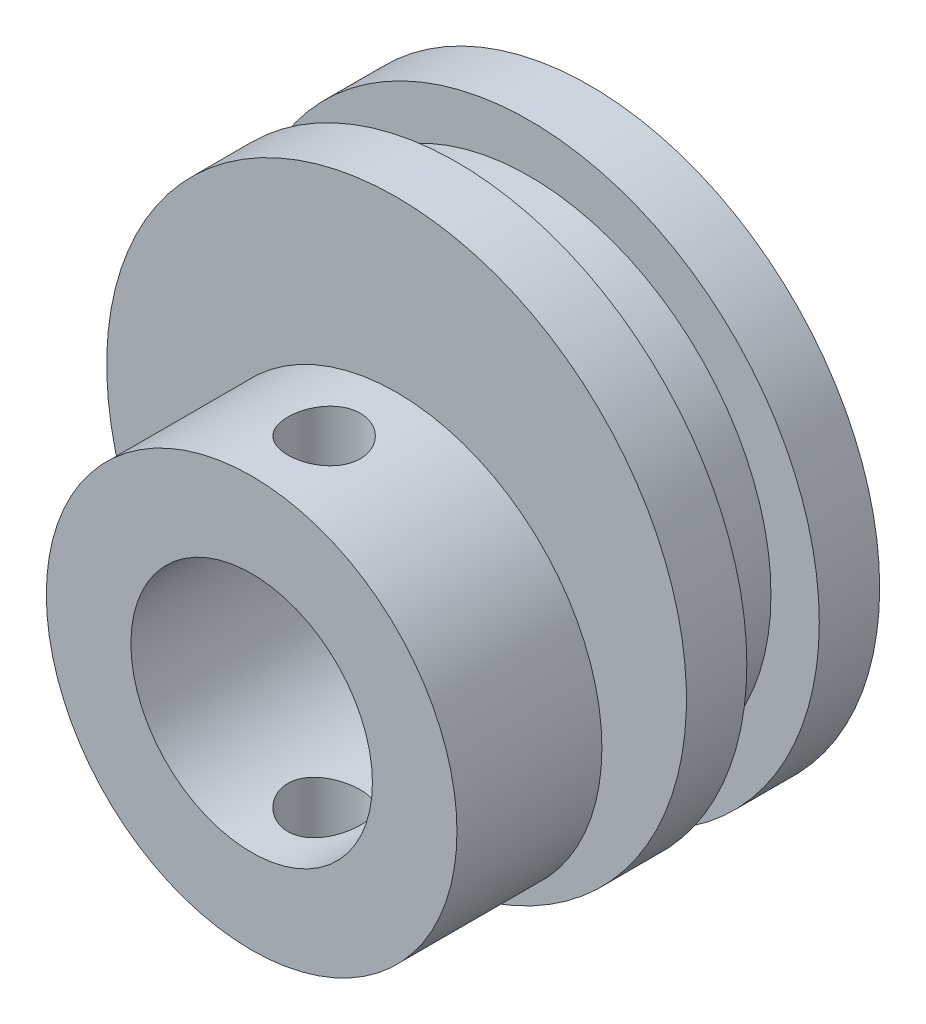
ISO-10303-21;
HEADER;
FILE_DESCRIPTION(('STEP AP214'),'2;1');
FILE_NAME('part.step','',(''),(''),'','','');
FILE_SCHEMA(('AUTOMOTIVE_DESIGN { 1 0 10303 214 1 1 1 1 }'));
ENDSEC;
DATA;
#1=APPLICATION_CONTEXT('core data for automotive mechanical design processes');
#2=APPLICATION_PROTOCOL_DEFINITION('international standard','automotive_design',2000,#1);
#3=PRODUCT_CONTEXT('',#1,'mechanical');
#4=PRODUCT('Part','Part','',(#3));
#5=PRODUCT_RELATED_PRODUCT_CATEGORY('part','',(#4));
#6=PRODUCT_DEFINITION_FORMATION('','',#4);
#7=PRODUCT_DEFINITION_CONTEXT('part definition',#1,'design');
#8=PRODUCT_DEFINITION('design','',#6,#7);
#9=PRODUCT_DEFINITION_SHAPE('','',#8);
#10=(LENGTH_UNIT() NAMED_UNIT(*) SI_UNIT(.MILLI.,.METRE.));
#11=(NAMED_UNIT(*) PLANE_ANGLE_UNIT() SI_UNIT($,.RADIAN.));
#12=(NAMED_UNIT(*) SI_UNIT($,.STERADIAN.) SOLID_ANGLE_UNIT());
#13=UNCERTAINTY_MEASURE_WITH_UNIT(LENGTH_MEASURE(1.E-05),#10,'distance_accuracy_value','');
#14=(GEOMETRIC_REPRESENTATION_CONTEXT(3) GLOBAL_UNCERTAINTY_ASSIGNED_CONTEXT((#13)) GLOBAL_UNIT_ASSIGNED_CONTEXT((#10,
#11,#12)) REPRESENTATION_CONTEXT('',''));
#15=CARTESIAN_POINT('',(0.,0.,0.));
#16=DIRECTION('',(0.,0.,1.));
#17=DIRECTION('',(1.,0.,0.));
#18=AXIS2_PLACEMENT_3D('',#15,#16,#17);
#19=CARTESIAN_POINT('',(0.,0.,4.));
#20=DIRECTION('',(0.,0.,-1.));
#21=DIRECTION('',(-1.,0.,0.));
#22=AXIS2_PLACEMENT_3D('',#19,#20,#21);
#23=CYLINDRICAL_SURFACE('',#22,12.);
#24=CARTESIAN_POINT('',(0.,0.,1.5));
#25=DIRECTION('',(0.,0.,1.));
#26=DIRECTION('',(1.,0.,0.));
#27=AXIS2_PLACEMENT_3D('',#24,#25,#26);
#28=CIRCLE('',#27,12.);
#29=CARTESIAN_POINT('',(12.,0.,1.5));
#30=VERTEX_POINT('',#29);
#31=EDGE_CURVE('E83',#30,#30,#28,.T.);
#32=ORIENTED_EDGE('',*,*,#31,.T.);
#33=EDGE_LOOP('',(#32));
#34=FACE_BOUND('',#33,.T.);
#35=CARTESIAN_POINT('',(0.,0.,4.));
#36=DIRECTION('',(0.,0.,1.));
#37=DIRECTION('',(1.,0.,0.));
#38=AXIS2_PLACEMENT_3D('',#35,#36,#37);
#39=CIRCLE('',#38,12.);
#40=CARTESIAN_POINT('',(0.,-12.,4.));
#41=VERTEX_POINT('',#40);
#42=EDGE_CURVE('E11',#41,#41,#39,.T.);
#43=ORIENTED_EDGE('',*,*,#42,.F.);
#44=EDGE_LOOP('',(#43));
#45=FACE_BOUND('',#44,.T.);
#46=ADVANCED_FACE('F39',(#34,#45),#23,.T.);
#47=CARTESIAN_POINT('',(0.,0.,4.));
#48=DIRECTION('',(0.,0.,1.));
#49=DIRECTION('',(1.,0.,0.));
#50=AXIS2_PLACEMENT_3D('',#47,#48,#49);
#51=PLANE('',#50);
#52=ORIENTED_EDGE('',*,*,#42,.T.);
#53=CARTESIAN_POINT('',(0.,-3.5,4.));
#54=DIRECTION('',(0.,0.,1.));
#55=DIRECTION('',(1.,0.,0.));
#56=AXIS2_PLACEMENT_3D('',#53,#54,#55);
#57=CIRCLE('',#56,8.5);
#58=EDGE_CURVE('E58',#41,#41,#57,.T.);
#59=ORIENTED_EDGE('',*,*,#58,.F.);
#60=EDGE_LOOP('',(#52,#59));
#61=FACE_BOUND('',#60,.T.);
#62=ADVANCED_FACE('F59',(#61),#51,.T.);
#63=CARTESIAN_POINT('',(0.,10.,1.5));
#64=DIRECTION('',(0.,0.,1.));
#65=DIRECTION('',(1.,0.,0.));
#66=AXIS2_PLACEMENT_3D('',#63,#64,#65);
#67=PLANE('',#66);
#68=CARTESIAN_POINT('',(0.,0.,1.5));
#69=DIRECTION('',(0.,0.,-1.));
#70=DIRECTION('',(-1.,0.,0.));
#71=AXIS2_PLACEMENT_3D('',#68,#69,#70);
#72=CIRCLE('',#71,10.);
#73=CARTESIAN_POINT('',(-10.,0.,1.5));
#74=VERTEX_POINT('',#73);
#75=EDGE_CURVE('E68',#74,#74,#72,.T.);
#76=ORIENTED_EDGE('',*,*,#75,.F.);
#77=EDGE_LOOP('',(#76));
#78=FACE_BOUND('',#77,.T.);
#79=ORIENTED_EDGE('',*,*,#31,.F.);
#80=EDGE_LOOP('',(#79));
#81=FACE_BOUND('',#80,.T.);
#82=ADVANCED_FACE('F146',(#78,#81),#67,.F.);
#83=CARTESIAN_POINT('',(0.,10.,-1.5));
#84=DIRECTION('',(0.,0.,-1.));
#85=DIRECTION('',(-1.,0.,0.));
#86=AXIS2_PLACEMENT_3D('',#83,#84,#85);
#87=PLANE('',#86);
#88=CARTESIAN_POINT('',(0.,0.,-1.5));
#89=DIRECTION('',(0.,0.,-1.));
#90=DIRECTION('',(-1.,0.,0.));
#91=AXIS2_PLACEMENT_3D('',#88,#89,#90);
#92=CIRCLE('',#91,10.);
#93=CARTESIAN_POINT('',(-10.,0.,-1.5));
#94=VERTEX_POINT('',#93);
#95=EDGE_CURVE('E73',#94,#94,#92,.T.);
#96=ORIENTED_EDGE('',*,*,#95,.T.);
#97=EDGE_LOOP('',(#96));
#98=FACE_BOUND('',#97,.T.);
#99=CARTESIAN_POINT('',(0.,0.,-1.5));
#100=DIRECTION('',(0.,0.,-1.));
#101=DIRECTION('',(-1.,0.,0.));
#102=AXIS2_PLACEMENT_3D('',#99,#100,#101);
#103=CIRCLE('',#102,12.);
#104=CARTESIAN_POINT('',(-12.,0.,-1.5));
#105=VERTEX_POINT('',#104);
#106=EDGE_CURVE('E80',#105,#105,#103,.T.);
#107=ORIENTED_EDGE('',*,*,#106,.F.);
#108=EDGE_LOOP('',(#107));
#109=FACE_BOUND('',#108,.T.);
#110=ADVANCED_FACE('F165',(#98,#109),#87,.F.);
#111=CARTESIAN_POINT('',(0.,0.,0.));
#112=DIRECTION('',(0.,0.,-1.));
#113=DIRECTION('',(-1.,0.,0.));
#114=AXIS2_PLACEMENT_3D('',#111,#112,#113);
#115=CYLINDRICAL_SURFACE('',#114,10.);
#116=ORIENTED_EDGE('',*,*,#95,.F.);
#117=EDGE_LOOP('',(#116));
#118=FACE_BOUND('',#117,.T.);
#119=ORIENTED_EDGE('',*,*,#75,.T.);
#120=EDGE_LOOP('',(#119));
#121=FACE_BOUND('',#120,.T.);
#122=ADVANCED_FACE('F114',(#118,#121),#115,.T.);
#123=CARTESIAN_POINT('',(0.,0.,-4.));
#124=DIRECTION('',(0.,0.,1.));
#125=DIRECTION('',(1.,0.,0.));
#126=AXIS2_PLACEMENT_3D('',#123,#124,#125);
#127=PLANE('',#126);
#128=CARTESIAN_POINT('',(0.,-3.5,-4.));
#129=DIRECTION('',(0.,0.,1.));
#130=DIRECTION('',(1.,0.,0.));
#131=AXIS2_PLACEMENT_3D('',#128,#129,#130);
#132=CIRCLE('',#131,5.);
#133=CARTESIAN_POINT('',(5.,-3.5,-4.));
#134=VERTEX_POINT('',#133);
#135=EDGE_CURVE('E62',#134,#134,#132,.T.);
#136=ORIENTED_EDGE('',*,*,#135,.T.);
#137=EDGE_LOOP('',(#136));
#138=FACE_BOUND('',#137,.T.);
#139=CARTESIAN_POINT('',(0.,0.,-4.));
#140=DIRECTION('',(0.,0.,1.));
#141=DIRECTION('',(1.,0.,0.));
#142=AXIS2_PLACEMENT_3D('',#139,#140,#141);
#143=CIRCLE('',#142,12.);
#144=CARTESIAN_POINT('',(12.,0.,-4.));
#145=VERTEX_POINT('',#144);
#146=EDGE_CURVE('E55',#145,#145,#143,.T.);
#147=ORIENTED_EDGE('',*,*,#146,.F.);
#148=EDGE_LOOP('',(#147));
#149=FACE_BOUND('',#148,.T.);
#150=ADVANCED_FACE('F147',(#138,#149),#127,.F.);
#151=ORIENTED_EDGE('',*,*,#106,.T.);
#152=EDGE_LOOP('',(#151));
#153=FACE_BOUND('',#152,.T.);
#154=ORIENTED_EDGE('',*,*,#146,.T.);
#155=EDGE_LOOP('',(#154));
#156=FACE_BOUND('',#155,.T.);
#157=ADVANCED_FACE('F41',(#153,#156),#23,.T.);
#158=CARTESIAN_POINT('',(0.,-3.5,10.));
#159=DIRECTION('',(0.,0.,-1.));
#160=DIRECTION('',(-1.,0.,0.));
#161=AXIS2_PLACEMENT_3D('',#158,#159,#160);
#162=CYLINDRICAL_SURFACE('',#161,8.5);
#163=CARTESIAN_POINT('',(0.,5.,8.5));
#164=CARTESIAN_POINT('',(-0.0835602073116835,4.99999852465812,8.4999967178691));
#165=CARTESIAN_POINT('',(-0.167164170899166,4.99875504437695,8.49299410009958));
#166=CARTESIAN_POINT('',(-0.332022204672921,4.99391434547826,8.46518320685825));
#167=CARTESIAN_POINT('',(-0.413274128543539,4.99031504366607,8.44436271235211));
#168=CARTESIAN_POINT('',(-0.571019510053261,4.9811659180518,8.38956848670668));
#169=CARTESIAN_POINT('',(-0.647516980962109,4.97561776634703,8.35560602873436));
#170=CARTESIAN_POINT('',(-0.793719300559721,4.9631790616307,8.27552262272467));
#171=CARTESIAN_POINT('',(-0.863424820850617,4.95628864154791,8.22940287849939));
#172=CARTESIAN_POINT('',(-0.99481651654955,4.94184556474541,8.12579132915274));
#173=CARTESIAN_POINT('',(-1.05641975336287,4.93428721228608,8.06819513097525));
#174=CARTESIAN_POINT('',(-1.1691412650637,4.91940313016037,7.94349027020933));
#175=CARTESIAN_POINT('',(-1.22025883768728,4.9120774161024,7.87638097100183));
#176=CARTESIAN_POINT('',(-1.31089615224234,4.89843282674879,7.73397760532877));
#177=CARTESIAN_POINT('',(-1.35033279728854,4.89212130489153,7.65862988281188));
#178=CARTESIAN_POINT('',(-1.41595715270317,4.88129933378097,7.5022490569533));
#179=CARTESIAN_POINT('',(-1.44214587005801,4.87678874764249,7.42121638626272));
#180=CARTESIAN_POINT('',(-1.48026740658905,4.87013636121934,7.25664894310292));
#181=CARTESIAN_POINT('',(-1.49234409471487,4.86797067223513,7.17314848174711));
#182=CARTESIAN_POINT('',(-1.50234505486158,4.86618114129228,7.00528048894824));
#183=CARTESIAN_POINT('',(-1.50027044993802,4.86655709762705,6.92091302684148));
#184=CARTESIAN_POINT('',(-1.48214465879202,4.86978659532625,6.75473986745596));
#185=CARTESIAN_POINT('',(-1.46625598617925,4.87261132730481,6.67291580162267));
#186=CARTESIAN_POINT('',(-1.42120852873224,4.88037493445764,6.51311326819002));
#187=CARTESIAN_POINT('',(-1.39204923880641,4.88531389010072,6.43513494708836));
#188=CARTESIAN_POINT('',(-1.32112618145376,4.89678011228507,6.28475593979735));
#189=CARTESIAN_POINT('',(-1.27929578300233,4.90331573888177,6.21238734241572));
#190=CARTESIAN_POINT('',(-1.18426514162452,4.91723322878402,6.075634979316));
#191=CARTESIAN_POINT('',(-1.13106387280683,4.92461516841691,6.0112519348913));
#192=CARTESIAN_POINT('',(-1.01392044402847,4.93951963661095,5.89135835341984));
#193=CARTESIAN_POINT('',(-0.949839043227183,4.94704269154381,5.83598383870425));
#194=CARTESIAN_POINT('',(-0.813223017047742,4.96128697681384,5.73675182224637));
#195=CARTESIAN_POINT('',(-0.74068832425797,4.96800820075587,5.69289441235745));
#196=CARTESIAN_POINT('',(-0.58909043349764,4.97990283414647,5.61792570133133));
#197=CARTESIAN_POINT('',(-0.510020681297826,4.98507466502145,5.58682738775337));
#198=CARTESIAN_POINT('',(-0.347668482380529,4.99327535201155,5.53839100335812));
#199=CARTESIAN_POINT('',(-0.264386432134316,4.99630440940878,5.52105164007075));
#200=CARTESIAN_POINT('',(-0.0971451116191692,4.99985092576813,5.50081200141636));
#201=CARTESIAN_POINT('',(-0.0132090843615073,5.00040083433622,5.49772516159403));
#202=CARTESIAN_POINT('',(0.153980271251543,4.99901631664242,5.50557941294352));
#203=CARTESIAN_POINT('',(0.237233629020516,4.99708199798832,5.51651989650209));
#204=CARTESIAN_POINT('',(0.400111048540306,4.99096650695861,5.55196307734012));
#205=CARTESIAN_POINT('',(0.479756042957809,4.98680079660993,5.57637247882884));
#206=CARTESIAN_POINT('',(0.633823333081783,4.97668767054273,5.63796046041181));
#207=CARTESIAN_POINT('',(0.708245306379776,4.97074014495488,5.67513982794151));
#208=CARTESIAN_POINT('',(0.850557919353285,4.95764232694309,5.7616330721365));
#209=CARTESIAN_POINT('',(0.918377380876573,4.95048081539685,5.81106232996766));
#210=CARTESIAN_POINT('',(1.04482575376698,4.93578086254215,5.92049471234006));
#211=CARTESIAN_POINT('',(1.10345391044434,4.92824239034875,5.98049870430486));
#212=CARTESIAN_POINT('',(1.21055495751759,4.91353196779635,6.11021768885172));
#213=CARTESIAN_POINT('',(1.25890120329949,4.90636532837837,6.18003794375939));
#214=CARTESIAN_POINT('',(1.34317887649159,4.89331262284435,6.32691843383291));
#215=CARTESIAN_POINT('',(1.37911073038509,4.88742651273966,6.40397842016974));
#216=CARTESIAN_POINT('',(1.43735470236499,4.87764200573802,6.56281171816086));
#217=CARTESIAN_POINT('',(1.45972757437841,4.8737347552807,6.64456218099255));
#218=CARTESIAN_POINT('',(1.49040804698522,4.86832903130758,6.81073623477485));
#219=CARTESIAN_POINT('',(1.4987170345307,4.86683032026719,6.89515956129641));
#220=CARTESIAN_POINT('',(1.50099164151106,4.86642243845549,7.0630165247977));
#221=CARTESIAN_POINT('',(1.49515678461176,4.86747724556748,7.14644743680322));
#222=CARTESIAN_POINT('',(1.46974322873663,4.87197817944576,7.31111994714207));
#223=CARTESIAN_POINT('',(1.45016459057914,4.87542429563016,7.39236155516174));
#224=CARTESIAN_POINT('',(1.39789926667029,4.88430518558531,7.55025834545232));
#225=CARTESIAN_POINT('',(1.36523178909751,4.88973704421377,7.62692006020943));
#226=CARTESIAN_POINT('',(1.2877371522897,4.90197983656061,7.77370686948198));
#227=CARTESIAN_POINT('',(1.24290927156669,4.90879085209956,7.84383157581883));
#228=CARTESIAN_POINT('',(1.1416626166475,4.92313765215559,7.97655797659853));
#229=CARTESIAN_POINT('',(1.0850977566265,4.93068186379938,8.0390473401217));
#230=CARTESIAN_POINT('',(0.962289483399127,4.94557973306428,8.15371472848376));
#231=CARTESIAN_POINT('',(0.896043845959504,4.95293334643561,8.20589037716824));
#232=CARTESIAN_POINT('',(0.755134398648692,4.96668871310451,8.29882734392791));
#233=CARTESIAN_POINT('',(0.680408643630285,4.97308254914894,8.33949593597092));
#234=CARTESIAN_POINT('',(0.525100290133701,4.9841208835999,8.40763861326231));
#235=CARTESIAN_POINT('',(0.444523462097549,4.98876707834471,8.43512550042316));
#236=CARTESIAN_POINT('',(0.303055940544959,4.99480295232011,8.47033309128865));
#237=CARTESIAN_POINT('',(0.243008531002894,4.99674116179219,8.48143982639593));
#238=CARTESIAN_POINT('',(0.121981841577228,4.9993402109253,8.49627440232578));
#239=CARTESIAN_POINT('',(0.0610025810358461,5.00000107706366,8.50000239609813));
#240=CARTESIAN_POINT('',(0.,5.,8.5));
#241=B_SPLINE_CURVE_WITH_KNOTS('',3,(#163,#164,#165,#166,#167,#168,#169,#170,#171,#172,#173,
#174,#175,#176,#177,#178,#179,#180,#181,#182,#183,#184,#185,#186,#187,#188,#189,#190,#191,#192,
#193,#194,#195,#196,#197,#198,#199,#200,#201,#202,#203,#204,#205,#206,#207,#208,#209,#210,#211,
#212,#213,#214,#215,#216,#217,#218,#219,#220,#221,#222,#223,#224,#225,#226,#227,#228,#229,#230,
#231,#232,#233,#234,#235,#236,#237,#238,#239,#240),.UNSPECIFIED.,.T.,.F.,(4,2,2,2,2,2,2,2,2,2,2,
2,2,2,2,2,2,2,2,2,2,2,2,2,2,2,2,2,2,2,2,2,2,2,2,2,2,2,4),(0.,0.250457591265239,
0.501136955741326,0.751601762620913,1.0020417778349,1.25487340234721,1.50772195440904,
1.76232827341925,2.01691523667498,2.26888345171767,2.52083167063641,2.76985538403527,
3.01888857629236,3.26925473797252,3.51964349748054,3.7735186488756,4.02739582496181,
4.28153078678122,4.53564187317985,4.78641705372855,5.03718137196445,5.2862301259127,
5.53529423973253,5.78679991739404,6.0383262351567,6.29279109855223,6.54724721920708,
6.80055459873066,7.05383699613264,7.30356724592812,7.55329639063616,7.80266038647827,
8.05203918055447,8.30473127243322,8.55748151381616,8.81221395085161,9.06669849128298,
9.24954720252122,9.43239212355177),.UNSPECIFIED.);
#242=CARTESIAN_POINT('',(0.,5.,8.5));
#243=VERTEX_POINT('',#242);
#244=EDGE_CURVE('E120',#243,#243,#241,.T.);
#245=ORIENTED_EDGE('',*,*,#244,.T.);
#246=EDGE_LOOP('',(#245));
#247=FACE_BOUND('',#246,.T.);
#248=CARTESIAN_POINT('',(0.,-12.,8.5));
#249=CARTESIAN_POINT('',(0.0835602073116835,-11.9999985246581,8.4999967178691));
#250=CARTESIAN_POINT('',(0.167164170899166,-11.998755044377,8.49299410009958));
#251=CARTESIAN_POINT('',(0.33202220467292,-11.9939143454783,8.46518320685825));
#252=CARTESIAN_POINT('',(0.413274128543538,-11.9903150436661,8.44436271235211));
#253=CARTESIAN_POINT('',(0.571019510053261,-11.9811659180518,8.38956848670668));
#254=CARTESIAN_POINT('',(0.647516980962108,-11.975617766347,8.35560602873436));
#255=CARTESIAN_POINT('',(0.79371930055972,-11.9631790616307,8.27552262272467));
#256=CARTESIAN_POINT('',(0.863424820850616,-11.9562886415479,8.22940287849939));
#257=CARTESIAN_POINT('',(0.994816516549548,-11.9418455647454,8.12579132915275));
#258=CARTESIAN_POINT('',(1.05641975336287,-11.9342872122861,8.06819513097525));
#259=CARTESIAN_POINT('',(1.1691412650637,-11.9194031301604,7.94349027020934));
#260=CARTESIAN_POINT('',(1.22025883768728,-11.9120774161024,7.87638097100183));
#261=CARTESIAN_POINT('',(1.31089615224234,-11.8984328267488,7.73397760532877));
#262=CARTESIAN_POINT('',(1.35033279728854,-11.8921213048915,7.65862988281188));
#263=CARTESIAN_POINT('',(1.41595715270317,-11.881299333781,7.5022490569533));
#264=CARTESIAN_POINT('',(1.44214587005801,-11.8767887476425,7.42121638626272));
#265=CARTESIAN_POINT('',(1.48026740658905,-11.8701363612193,7.25664894310292));
#266=CARTESIAN_POINT('',(1.49234409471487,-11.8679706722351,7.17314848174711));
#267=CARTESIAN_POINT('',(1.50234505486158,-11.8661811412923,7.00528048894824));
#268=CARTESIAN_POINT('',(1.50027044993802,-11.8665570976271,6.92091302684149));
#269=CARTESIAN_POINT('',(1.48214465879202,-11.8697865953263,6.75473986745596));
#270=CARTESIAN_POINT('',(1.46625598617925,-11.8726113273048,6.67291580162267));
#271=CARTESIAN_POINT('',(1.42120852873224,-11.8803749344576,6.51311326819002));
#272=CARTESIAN_POINT('',(1.39204923880641,-11.8853138901007,6.43513494708836));
#273=CARTESIAN_POINT('',(1.32112618145376,-11.8967801122851,6.28475593979735));
#274=CARTESIAN_POINT('',(1.27929578300233,-11.9033157388818,6.21238734241572));
#275=CARTESIAN_POINT('',(1.18426514162452,-11.917233228784,6.075634979316));
#276=CARTESIAN_POINT('',(1.13106387280683,-11.9246151684169,6.0112519348913));
#277=CARTESIAN_POINT('',(1.01392044402847,-11.939519636611,5.89135835341984));
#278=CARTESIAN_POINT('',(0.949839043227182,-11.9470426915438,5.83598383870425));
#279=CARTESIAN_POINT('',(0.813223017047741,-11.9612869768138,5.73675182224637));
#280=CARTESIAN_POINT('',(0.74068832425797,-11.9680082007559,5.69289441235744));
#281=CARTESIAN_POINT('',(0.58909043349764,-11.9799028341465,5.61792570133133));
#282=CARTESIAN_POINT('',(0.510020681297825,-11.9850746650215,5.58682738775337));
#283=CARTESIAN_POINT('',(0.347668482380528,-11.9932753520116,5.53839100335812));
#284=CARTESIAN_POINT('',(0.264386432134316,-11.9963044094088,5.52105164007075));
#285=CARTESIAN_POINT('',(0.0971451116191684,-11.9998509257681,5.50081200141636));
#286=CARTESIAN_POINT('',(0.0132090843615066,-12.0004008343362,5.49772516159403));
#287=CARTESIAN_POINT('',(-0.153980271251543,-11.9990163166424,5.50557941294352));
#288=CARTESIAN_POINT('',(-0.237233629020516,-11.9970819979883,5.51651989650209));
#289=CARTESIAN_POINT('',(-0.400111048540306,-11.9909665069586,5.55196307734012));
#290=CARTESIAN_POINT('',(-0.479756042957809,-11.9868007966099,5.57637247882884));
#291=CARTESIAN_POINT('',(-0.633823333081783,-11.9766876705427,5.63796046041181));
#292=CARTESIAN_POINT('',(-0.708245306379776,-11.9707401449549,5.67513982794151));
#293=CARTESIAN_POINT('',(-0.850557919353285,-11.9576423269431,5.7616330721365));
#294=CARTESIAN_POINT('',(-0.918377380876573,-11.9504808153968,5.81106232996766));
#295=CARTESIAN_POINT('',(-1.04482575376698,-11.9357808625422,5.92049471234006));
#296=CARTESIAN_POINT('',(-1.10345391044434,-11.9282423903488,5.98049870430486));
#297=CARTESIAN_POINT('',(-1.21055495751759,-11.9135319677964,6.11021768885172));
#298=CARTESIAN_POINT('',(-1.25890120329949,-11.9063653283784,6.18003794375939));
#299=CARTESIAN_POINT('',(-1.34317887649159,-11.8933126228444,6.32691843383291));
#300=CARTESIAN_POINT('',(-1.37911073038509,-11.8874265127397,6.40397842016974));
#301=CARTESIAN_POINT('',(-1.43735470236499,-11.877642005738,6.56281171816086));
#302=CARTESIAN_POINT('',(-1.45972757437841,-11.8737347552807,6.64456218099255));
#303=CARTESIAN_POINT('',(-1.49040804698522,-11.8683290313076,6.81073623477485));
#304=CARTESIAN_POINT('',(-1.4987170345307,-11.8668303202672,6.89515956129642));
#305=CARTESIAN_POINT('',(-1.50099164151106,-11.8664224384555,7.0630165247977));
#306=CARTESIAN_POINT('',(-1.49515678461176,-11.8674772455675,7.14644743680323));
#307=CARTESIAN_POINT('',(-1.46974322873663,-11.8719781794458,7.31111994714207));
#308=CARTESIAN_POINT('',(-1.45016459057914,-11.8754242956302,7.39236155516174));
#309=CARTESIAN_POINT('',(-1.39789926667029,-11.8843051855853,7.55025834545232));
#310=CARTESIAN_POINT('',(-1.36523178909751,-11.8897370442138,7.62692006020943));
#311=CARTESIAN_POINT('',(-1.2877371522897,-11.9019798365606,7.77370686948198));
#312=CARTESIAN_POINT('',(-1.24290927156669,-11.9087908520996,7.84383157581884));
#313=CARTESIAN_POINT('',(-1.1416626166475,-11.9231376521556,7.97655797659853));
#314=CARTESIAN_POINT('',(-1.0850977566265,-11.9306818637994,8.0390473401217));
#315=CARTESIAN_POINT('',(-0.962289483399125,-11.9455797330643,8.15371472848376));
#316=CARTESIAN_POINT('',(-0.896043845959503,-11.9529333464356,8.20589037716825));
#317=CARTESIAN_POINT('',(-0.75513439864869,-11.9666887131045,8.29882734392791));
#318=CARTESIAN_POINT('',(-0.680408643630283,-11.9730825491489,8.33949593597092));
#319=CARTESIAN_POINT('',(-0.525100290133698,-11.9841208835999,8.40763861326231));
#320=CARTESIAN_POINT('',(-0.444523462097546,-11.9887670783447,8.43512550042317));
#321=CARTESIAN_POINT('',(-0.303055940544957,-11.9948029523201,8.47033309128865));
#322=CARTESIAN_POINT('',(-0.243008531002893,-11.9967411617922,8.48143982639593));
#323=CARTESIAN_POINT('',(-0.121981841577228,-11.9993402109253,8.49627440232578));
#324=CARTESIAN_POINT('',(-0.061002581035846,-12.0000010770637,8.50000239609813));
#325=CARTESIAN_POINT('',(0.,-12.,8.5));
#326=B_SPLINE_CURVE_WITH_KNOTS('',3,(#248,#249,#250,#251,#252,#253,#254,#255,#256,#257,#258,
#259,#260,#261,#262,#263,#264,#265,#266,#267,#268,#269,#270,#271,#272,#273,#274,#275,#276,#277,
#278,#279,#280,#281,#282,#283,#284,#285,#286,#287,#288,#289,#290,#291,#292,#293,#294,#295,#296,
#297,#298,#299,#300,#301,#302,#303,#304,#305,#306,#307,#308,#309,#310,#311,#312,#313,#314,#315,
#316,#317,#318,#319,#320,#321,#322,#323,#324,#325),.UNSPECIFIED.,.T.,.F.,(4,2,2,2,2,2,2,2,2,2,2,
2,2,2,2,2,2,2,2,2,2,2,2,2,2,2,2,2,2,2,2,2,2,2,2,2,2,2,4),(0.,0.250457591265239,
0.501136955741326,0.751601762620913,1.0020417778349,1.25487340234721,1.50772195440904,
1.76232827341925,2.01691523667498,2.26888345171766,2.52083167063641,2.76985538403527,
3.01888857629236,3.26925473797252,3.51964349748054,3.7735186488756,4.02739582496181,
4.28153078678122,4.53564187317985,4.78641705372855,5.03718137196445,5.2862301259127,
5.53529423973253,5.78679991739404,6.0383262351567,6.29279109855223,6.54724721920708,
6.80055459873066,7.05383699613265,7.30356724592812,7.55329639063616,7.80266038647828,
8.05203918055447,8.30473127243323,8.55748151381616,8.81221395085161,9.06669849128298,
9.24954720252122,9.43239212355177),.UNSPECIFIED.);
#327=CARTESIAN_POINT('',(0.,-12.,8.5));
#328=VERTEX_POINT('',#327);
#329=EDGE_CURVE('E124',#328,#328,#326,.T.);
#330=ORIENTED_EDGE('',*,*,#329,.T.);
#331=EDGE_LOOP('',(#330));
#332=FACE_BOUND('',#331,.T.);
#333=CARTESIAN_POINT('',(0.,-3.5,10.));
#334=DIRECTION('',(0.,0.,1.));
#335=DIRECTION('',(1.,0.,0.));
#336=AXIS2_PLACEMENT_3D('',#333,#334,#335);
#337=CIRCLE('',#336,8.5);
#338=CARTESIAN_POINT('',(8.5,-3.5,10.));
#339=VERTEX_POINT('',#338);
#340=EDGE_CURVE('E65',#339,#339,#337,.T.);
#341=ORIENTED_EDGE('',*,*,#340,.F.);
#342=EDGE_LOOP('',(#341));
#343=FACE_BOUND('',#342,.T.);
#344=ORIENTED_EDGE('',*,*,#58,.T.);
#345=EDGE_LOOP('',(#344));
#346=FACE_BOUND('',#345,.T.);
#347=ADVANCED_FACE('F110',(#247,#332,#343,#346),#162,.T.);
#348=CARTESIAN_POINT('',(0.,-3.5,10.));
#349=DIRECTION('',(0.,0.,1.));
#350=DIRECTION('',(1.,0.,0.));
#351=AXIS2_PLACEMENT_3D('',#348,#349,#350);
#352=PLANE('',#351);
#353=CARTESIAN_POINT('',(0.,-3.5,10.000012));
#354=DIRECTION('',(0.,0.,1.));
#355=DIRECTION('',(1.,0.,0.));
#356=AXIS2_PLACEMENT_3D('',#353,#354,#355);
#357=CIRCLE('',#356,5.);
#358=CARTESIAN_POINT('',(5.,-3.5,10.000012));
#359=VERTEX_POINT('',#358);
#360=EDGE_CURVE('E70',#359,#359,#357,.T.);
#361=ORIENTED_EDGE('',*,*,#360,.F.);
#362=EDGE_LOOP('',(#361));
#363=FACE_BOUND('',#362,.T.);
#364=ORIENTED_EDGE('',*,*,#340,.T.);
#365=EDGE_LOOP('',(#364));
#366=FACE_BOUND('',#365,.T.);
#367=ADVANCED_FACE('F100',(#363,#366),#352,.T.);
#368=CARTESIAN_POINT('',(0.,-3.5,-4.));
#369=DIRECTION('',(0.,0.,1.));
#370=DIRECTION('',(1.,0.,0.));
#371=AXIS2_PLACEMENT_3D('',#368,#369,#370);
#372=CYLINDRICAL_SURFACE('',#371,5.);
#373=CARTESIAN_POINT('',(0.,-8.5,8.5));
#374=CARTESIAN_POINT('',(-0.0822886127532998,-8.4999992925055,8.49999900251511));
#375=CARTESIAN_POINT('',(-0.164587318351529,-8.49794915693954,8.49320613637603));
#376=CARTESIAN_POINT('',(-0.32678812530488,-8.48997105593691,8.4662786457779));
#377=CARTESIAN_POINT('',(-0.406689504411419,-8.48404193389692,8.44614004197666));
#378=CARTESIAN_POINT('',(-0.561732707754526,-8.46895552501836,8.39325398308974));
#379=CARTESIAN_POINT('',(-0.636881364395373,-8.45980300250426,8.36052513038107));
#380=CARTESIAN_POINT('',(-0.780624181053131,-8.43922109237645,8.28346390694417));
#381=CARTESIAN_POINT('',(-0.849217467469669,-8.42779140192067,8.23912999260458));
#382=CARTESIAN_POINT('',(-0.979871797183745,-8.40350737192774,8.13877599252733));
#383=CARTESIAN_POINT('',(-1.04171807124434,-8.39062383657036,8.08248337411409));
#384=CARTESIAN_POINT('',(-1.15524920923324,-8.36505834210442,7.96039077008982));
#385=CARTESIAN_POINT('',(-1.20693236327441,-8.35237641724502,7.89458918787504));
#386=CARTESIAN_POINT('',(-1.29980037723708,-8.32834113993772,7.75352924696239));
#387=CARTESIAN_POINT('',(-1.34072309022213,-8.31702406663875,7.67809153900926));
#388=CARTESIAN_POINT('',(-1.4092139477476,-8.29743620394031,7.52101074576971));
#389=CARTESIAN_POINT('',(-1.43678529919973,-8.28916468313311,7.43936915607203));
#390=CARTESIAN_POINT('',(-1.47701633682652,-8.27690870838434,7.27460973386954));
#391=CARTESIAN_POINT('',(-1.49007196234677,-8.27281069324534,7.19159725613606));
#392=CARTESIAN_POINT('',(-1.50213730614672,-8.26902789749768,7.02446684378324));
#393=CARTESIAN_POINT('',(-1.50115042761078,-8.26934204760571,6.94034918194091));
#394=CARTESIAN_POINT('',(-1.48546977199812,-8.27424744067778,6.77661609139152));
#395=CARTESIAN_POINT('',(-1.47127205262685,-8.27868388599141,6.69694774963776));
#396=CARTESIAN_POINT('',(-1.43037420427056,-8.29108356228624,6.54118021372654));
#397=CARTESIAN_POINT('',(-1.40367284141641,-8.29904714132351,6.46508137262567));
#398=CARTESIAN_POINT('',(-1.33816026653682,-8.31772733074973,6.31739965033926));
#399=CARTESIAN_POINT('',(-1.29918816934642,-8.32848016115952,6.24589291604474));
#400=CARTESIAN_POINT('',(-1.21035222588683,-8.35150987000065,6.11026797798981));
#401=CARTESIAN_POINT('',(-1.16048574002588,-8.36378711746991,6.04615157058622));
#402=CARTESIAN_POINT('',(-1.04881290765546,-8.38911011297937,5.92431380923798));
#403=CARTESIAN_POINT('',(-0.986594907466972,-8.40216654310498,5.86697133597033));
#404=CARTESIAN_POINT('',(-0.853263259313968,-8.42712244063259,5.76344601593575));
#405=CARTESIAN_POINT('',(-0.782149051860889,-8.4390218351841,5.71726387158557));
#406=CARTESIAN_POINT('',(-0.632355038342804,-8.4604316006947,5.63714007753527));
#407=CARTESIAN_POINT('',(-0.553627749747951,-8.46992543668314,5.60328248375014));
#408=CARTESIAN_POINT('',(-0.39124541560352,-8.48533521832222,5.54940040990037));
#409=CARTESIAN_POINT('',(-0.307591751589582,-8.49125216187,5.52937207146751));
#410=CARTESIAN_POINT('',(-0.140952242668332,-8.49868364643539,5.50434782210061));
#411=CARTESIAN_POINT('',(-0.0580500976011877,-8.5003485041779,5.49883841419839));
#412=CARTESIAN_POINT('',(0.107499605823382,-8.4995292324176,5.50156915571208));
#413=CARTESIAN_POINT('',(0.19014719669078,-8.49704565677757,5.50980746965144));
#414=CARTESIAN_POINT('',(0.350903605309696,-8.48830696987163,5.53938461111149));
#415=CARTESIAN_POINT('',(0.429072772614168,-8.48213829799417,5.56042338758087));
#416=CARTESIAN_POINT('',(0.580754638954521,-8.46674347841533,5.6146432327782));
#417=CARTESIAN_POINT('',(0.654266777025583,-8.45751696321085,5.64782576103786));
#418=CARTESIAN_POINT('',(0.796437189461052,-8.43669654351325,5.72625316548113));
#419=CARTESIAN_POINT('',(0.864943826199669,-8.42505280829675,5.77175934094797));
#420=CARTESIAN_POINT('',(0.993523307980146,-8.40073468764318,5.87322475405281));
#421=CARTESIAN_POINT('',(1.05359403235593,-8.3880600443108,5.92918661188767));
#422=CARTESIAN_POINT('',(1.16585744551027,-8.36253171869138,6.05238730836934));
#423=CARTESIAN_POINT('',(1.21768481231504,-8.34968825033268,6.11996187577174));
#424=CARTESIAN_POINT('',(1.30928995072154,-8.32576515238464,6.26312793901353));
#425=CARTESIAN_POINT('',(1.34906803829472,-8.31468547654651,6.33871922455821));
#426=CARTESIAN_POINT('',(1.41517347127168,-8.29567189615055,6.49553249125469));
#427=CARTESIAN_POINT('',(1.4415634693705,-8.28772337843827,6.57672618653659));
#428=CARTESIAN_POINT('',(1.48021730815114,-8.27591594362794,6.74268796893148));
#429=CARTESIAN_POINT('',(1.49248598978779,-8.272055625083,6.82745482078767));
#430=CARTESIAN_POINT('',(1.50221984485059,-8.26899972496087,6.99436151837623));
#431=CARTESIAN_POINT('',(1.5002805530849,-8.26961647442755,7.07646365101759));
#432=CARTESIAN_POINT('',(1.48307505444813,-8.27499401288295,7.2391141033728));
#433=CARTESIAN_POINT('',(1.46780938124716,-8.27975463592551,7.31966248517635));
#434=CARTESIAN_POINT('',(1.42476888804136,-8.29275763670386,7.47594539914285));
#435=CARTESIAN_POINT('',(1.39715175507068,-8.30095604545965,7.55172728736169));
#436=CARTESIAN_POINT('',(1.33031507121129,-8.31990278909136,7.69764243881772));
#437=CARTESIAN_POINT('',(1.29109329962876,-8.33065161194312,7.76777461764076));
#438=CARTESIAN_POINT('',(1.20048763805072,-8.35397676425833,7.90316311652711));
#439=CARTESIAN_POINT('',(1.14871276092994,-8.36660540163798,7.96814876126041));
#440=CARTESIAN_POINT('',(1.03517434629782,-8.39201320450026,8.08870249830786));
#441=CARTESIAN_POINT('',(0.973408217134502,-8.40479240823905,8.14426813946776));
#442=CARTESIAN_POINT('',(0.839465762183248,-8.42950936570649,8.24602341229503));
#443=CARTESIAN_POINT('',(0.767037885790608,-8.44141159765674,8.29189144685549));
#444=CARTESIAN_POINT('',(0.61514137398353,-8.46260680455813,8.37073516990402));
#445=CARTESIAN_POINT('',(0.535676052998955,-8.47190099931067,8.40371688827451));
#446=CARTESIAN_POINT('',(0.380757712655282,-8.48602174969301,8.45289527565275));
#447=CARTESIAN_POINT('',(0.305786961954234,-8.49122027381068,8.47051167288325));
#448=CARTESIAN_POINT('',(0.153880195230779,-8.49820944494492,8.49406352524158));
#449=CARTESIAN_POINT('',(0.0769445098581396,-8.5000006615474,8.50000093270482));
#450=CARTESIAN_POINT('',(0.,-8.5,8.5));
#451=B_SPLINE_CURVE_WITH_KNOTS('',3,(#373,#374,#375,#376,#377,#378,#379,#380,#381,#382,#383,
#384,#385,#386,#387,#388,#389,#390,#391,#392,#393,#394,#395,#396,#397,#398,#399,#400,#401,#402,
#403,#404,#405,#406,#407,#408,#409,#410,#411,#412,#413,#414,#415,#416,#417,#418,#419,#420,#421,
#422,#423,#424,#425,#426,#427,#428,#429,#430,#431,#432,#433,#434,#435,#436,#437,#438,#439,#440,
#441,#442,#443,#444,#445,#446,#447,#448,#449,#450),.UNSPECIFIED.,.T.,.F.,(4,2,2,2,2,2,2,2,2,2,2,
2,2,2,2,2,2,2,2,2,2,2,2,2,2,2,2,2,2,2,2,2,2,2,2,2,2,2,4),(0.,0.24658320361261,0.493239964846,
0.739533676300874,0.985860164412702,1.23855602948191,1.49129437288633,1.74971481004109,
2.00807314543224,2.25919689356599,2.51025978319089,2.75226016697676,2.99428443658001,
3.2396242644712,3.48502360158555,3.74067104048167,3.99633456531071,4.25371046881688,
4.51101453528808,4.75908809438545,5.00712853550327,5.24956746682327,5.49203554593728,
5.74011305702908,5.98825282000191,6.24540400322819,6.5025484425268,6.75847814951252,
7.01432009460283,7.25950155466943,7.504673196616,7.74680040402721,7.98897397553107,
8.23996925679931,8.49102974897502,8.74942996156671,9.00770911595235,9.2383169193046,
9.46888616948875),.UNSPECIFIED.);
#452=CARTESIAN_POINT('',(0.,-8.5,8.5));
#453=VERTEX_POINT('',#452);
#454=EDGE_CURVE('E43',#453,#453,#451,.T.);
#455=ORIENTED_EDGE('',*,*,#454,.T.);
#456=EDGE_LOOP('',(#455));
#457=FACE_BOUND('',#456,.T.);
#458=CARTESIAN_POINT('',(0.,1.5,8.5));
#459=CARTESIAN_POINT('',(0.0822886127533,1.49999929250549,8.49999900251511));
#460=CARTESIAN_POINT('',(0.164587318351529,1.49794915693953,8.49320613637603));
#461=CARTESIAN_POINT('',(0.326788125304881,1.48997105593691,8.4662786457779));
#462=CARTESIAN_POINT('',(0.40668950441142,1.48404193389692,8.44614004197666));
#463=CARTESIAN_POINT('',(0.561732707754527,1.46895552501836,8.39325398308974));
#464=CARTESIAN_POINT('',(0.636881364395374,1.45980300250425,8.36052513038107));
#465=CARTESIAN_POINT('',(0.780624181053132,1.43922109237645,8.28346390694417));
#466=CARTESIAN_POINT('',(0.84921746746967,1.42779140192067,8.23912999260458));
#467=CARTESIAN_POINT('',(0.979871797183746,1.40350737192774,8.13877599252733));
#468=CARTESIAN_POINT('',(1.04171807124434,1.39062383657036,8.08248337411409));
#469=CARTESIAN_POINT('',(1.15524920923324,1.36505834210442,7.96039077008981));
#470=CARTESIAN_POINT('',(1.20693236327441,1.35237641724501,7.89458918787504));
#471=CARTESIAN_POINT('',(1.29980037723708,1.32834113993772,7.75352924696239));
#472=CARTESIAN_POINT('',(1.34072309022214,1.31702406663875,7.67809153900926));
#473=CARTESIAN_POINT('',(1.4092139477476,1.29743620394031,7.52101074576971));
#474=CARTESIAN_POINT('',(1.43678529919973,1.2891646831331,7.43936915607202));
#475=CARTESIAN_POINT('',(1.47701633682652,1.27690870838434,7.27460973386954));
#476=CARTESIAN_POINT('',(1.49007196234677,1.27281069324533,7.19159725613606));
#477=CARTESIAN_POINT('',(1.50213730614672,1.26902789749767,7.02446684378323));
#478=CARTESIAN_POINT('',(1.50115042761078,1.26934204760571,6.94034918194091));
#479=CARTESIAN_POINT('',(1.48546977199812,1.27424744067778,6.77661609139152));
#480=CARTESIAN_POINT('',(1.47127205262685,1.2786838859914,6.69694774963776));
#481=CARTESIAN_POINT('',(1.43037420427056,1.29108356228624,6.54118021372654));
#482=CARTESIAN_POINT('',(1.40367284141641,1.2990471413235,6.46508137262567));
#483=CARTESIAN_POINT('',(1.33816026653682,1.31772733074973,6.31739965033926));
#484=CARTESIAN_POINT('',(1.29918816934642,1.32848016115952,6.24589291604474));
#485=CARTESIAN_POINT('',(1.21035222588683,1.35150987000064,6.11026797798981));
#486=CARTESIAN_POINT('',(1.16048574002588,1.36378711746991,6.04615157058622));
#487=CARTESIAN_POINT('',(1.04881290765546,1.38911011297937,5.92431380923798));
#488=CARTESIAN_POINT('',(0.986594907466973,1.40216654310498,5.86697133597033));
#489=CARTESIAN_POINT('',(0.853263259313968,1.42712244063258,5.76344601593575));
#490=CARTESIAN_POINT('',(0.782149051860888,1.4390218351841,5.71726387158557));
#491=CARTESIAN_POINT('',(0.632355038342804,1.4604316006947,5.63714007753527));
#492=CARTESIAN_POINT('',(0.553627749747951,1.46992543668314,5.60328248375014));
#493=CARTESIAN_POINT('',(0.39124541560352,1.48533521832222,5.54940040990037));
#494=CARTESIAN_POINT('',(0.307591751589581,1.49125216186999,5.52937207146751));
#495=CARTESIAN_POINT('',(0.140952242668331,1.49868364643538,5.50434782210061));
#496=CARTESIAN_POINT('',(0.0580500976011866,1.5003485041779,5.49883841419839));
#497=CARTESIAN_POINT('',(-0.107499605823383,1.49952923241759,5.50156915571208));
#498=CARTESIAN_POINT('',(-0.190147196690781,1.49704565677756,5.50980746965144));
#499=CARTESIAN_POINT('',(-0.350903605309697,1.48830696987163,5.5393846111115));
#500=CARTESIAN_POINT('',(-0.42907277261417,1.48213829799417,5.56042338758087));
#501=CARTESIAN_POINT('',(-0.580754638954522,1.46674347841532,5.6146432327782));
#502=CARTESIAN_POINT('',(-0.654266777025584,1.45751696321085,5.64782576103786));
#503=CARTESIAN_POINT('',(-0.796437189461053,1.43669654351325,5.72625316548113));
#504=CARTESIAN_POINT('',(-0.864943826199671,1.42505280829675,5.77175934094797));
#505=CARTESIAN_POINT('',(-0.993523307980148,1.40073468764317,5.87322475405281));
#506=CARTESIAN_POINT('',(-1.05359403235594,1.3880600443108,5.92918661188767));
#507=CARTESIAN_POINT('',(-1.16585744551027,1.36253171869138,6.05238730836935));
#508=CARTESIAN_POINT('',(-1.21768481231504,1.34968825033267,6.11996187577174));
#509=CARTESIAN_POINT('',(-1.30928995072154,1.32576515238463,6.26312793901353));
#510=CARTESIAN_POINT('',(-1.34906803829472,1.31468547654651,6.33871922455821));
#511=CARTESIAN_POINT('',(-1.41517347127168,1.29567189615055,6.49553249125469));
#512=CARTESIAN_POINT('',(-1.4415634693705,1.28772337843827,6.57672618653659));
#513=CARTESIAN_POINT('',(-1.48021730815114,1.27591594362794,6.74268796893148));
#514=CARTESIAN_POINT('',(-1.49248598978779,1.272055625083,6.82745482078767));
#515=CARTESIAN_POINT('',(-1.50221984485059,1.26899972496087,6.99436151837623));
#516=CARTESIAN_POINT('',(-1.5002805530849,1.26961647442754,7.07646365101759));
#517=CARTESIAN_POINT('',(-1.48307505444813,1.27499401288294,7.2391141033728));
#518=CARTESIAN_POINT('',(-1.46780938124716,1.27975463592551,7.31966248517635));
#519=CARTESIAN_POINT('',(-1.42476888804136,1.29275763670385,7.47594539914285));
#520=CARTESIAN_POINT('',(-1.39715175507068,1.30095604545964,7.55172728736169));
#521=CARTESIAN_POINT('',(-1.33031507121129,1.31990278909136,7.69764243881772));
#522=CARTESIAN_POINT('',(-1.29109329962876,1.33065161194312,7.76777461764076));
#523=CARTESIAN_POINT('',(-1.20048763805072,1.35397676425833,7.90316311652711));
#524=CARTESIAN_POINT('',(-1.14871276092994,1.36660540163797,7.96814876126041));
#525=CARTESIAN_POINT('',(-1.03517434629782,1.39201320450026,8.08870249830787));
#526=CARTESIAN_POINT('',(-0.9734082171345,1.40479240823905,8.14426813946776));
#527=CARTESIAN_POINT('',(-0.839465762183248,1.42950936570649,8.24602341229503));
#528=CARTESIAN_POINT('',(-0.767037885790608,1.44141159765674,8.29189144685549));
#529=CARTESIAN_POINT('',(-0.61514137398353,1.46260680455813,8.37073516990402));
#530=CARTESIAN_POINT('',(-0.535676052998955,1.47190099931066,8.40371688827451));
#531=CARTESIAN_POINT('',(-0.380757712655281,1.48602174969301,8.45289527565275));
#532=CARTESIAN_POINT('',(-0.305786961954234,1.49122027381068,8.47051167288325));
#533=CARTESIAN_POINT('',(-0.15388019523078,1.49820944494492,8.49406352524158));
#534=CARTESIAN_POINT('',(-0.0769445098581396,1.5000006615474,8.50000093270482));
#535=CARTESIAN_POINT('',(0.,1.5,8.5));
#536=B_SPLINE_CURVE_WITH_KNOTS('',3,(#458,#459,#460,#461,#462,#463,#464,#465,#466,#467,#468,
#469,#470,#471,#472,#473,#474,#475,#476,#477,#478,#479,#480,#481,#482,#483,#484,#485,#486,#487,
#488,#489,#490,#491,#492,#493,#494,#495,#496,#497,#498,#499,#500,#501,#502,#503,#504,#505,#506,
#507,#508,#509,#510,#511,#512,#513,#514,#515,#516,#517,#518,#519,#520,#521,#522,#523,#524,#525,
#526,#527,#528,#529,#530,#531,#532,#533,#534,#535),.UNSPECIFIED.,.T.,.F.,(4,2,2,2,2,2,2,2,2,2,2,
2,2,2,2,2,2,2,2,2,2,2,2,2,2,2,2,2,2,2,2,2,2,2,2,2,2,2,4),(0.,0.246583203612611,0.493239964846,
0.739533676300875,0.985860164412703,1.23855602948192,1.49129437288633,1.74971481004109,
2.00807314543224,2.25919689356599,2.51025978319089,2.75226016697676,2.99428443658001,
3.2396242644712,3.48502360158555,3.74067104048167,3.99633456531071,4.25371046881689,
4.51101453528808,4.75908809438545,5.00712853550327,5.24956746682327,5.49203554593729,
5.74011305702908,5.98825282000191,6.24540400322819,6.50254844252681,6.75847814951252,
7.01432009460283,7.25950155466943,7.504673196616,7.74680040402721,7.98897397553107,
8.23996925679931,8.49102974897502,8.74942996156671,9.00770911595235,9.2383169193046,
9.46888616948875),.UNSPECIFIED.);
#537=CARTESIAN_POINT('',(0.,1.5,8.5));
#538=VERTEX_POINT('',#537);
#539=EDGE_CURVE('E91',#538,#538,#536,.T.);
#540=ORIENTED_EDGE('',*,*,#539,.T.);
#541=EDGE_LOOP('',(#540));
#542=FACE_BOUND('',#541,.T.);
#543=ORIENTED_EDGE('',*,*,#135,.F.);
#544=EDGE_LOOP('',(#543));
#545=FACE_BOUND('',#544,.T.);
#546=ORIENTED_EDGE('',*,*,#360,.T.);
#547=EDGE_LOOP('',(#546));
#548=FACE_BOUND('',#547,.T.);
#549=ADVANCED_FACE('F106',(#457,#542,#545,#548),#372,.F.);
#550=CARTESIAN_POINT('',(0.,-12.,7.));
#551=DIRECTION('',(0.,1.,0.));
#552=DIRECTION('',(0.,0.,1.));
#553=AXIS2_PLACEMENT_3D('',#550,#551,#552);
#554=CYLINDRICAL_SURFACE('',#553,1.5);
#555=ORIENTED_EDGE('',*,*,#539,.F.);
#556=EDGE_LOOP('',(#555));
#557=FACE_BOUND('',#556,.T.);
#558=ORIENTED_EDGE('',*,*,#244,.F.);
#559=EDGE_LOOP('',(#558));
#560=FACE_BOUND('',#559,.T.);
#561=ADVANCED_FACE('F131',(#557,#560),#554,.F.);
#562=ORIENTED_EDGE('',*,*,#454,.F.);
#563=EDGE_LOOP('',(#562));
#564=FACE_BOUND('',#563,.T.);
#565=ORIENTED_EDGE('',*,*,#329,.F.);
#566=EDGE_LOOP('',(#565));
#567=FACE_BOUND('',#566,.T.);
#568=ADVANCED_FACE('F126',(#564,#567),#554,.F.);
#569=CLOSED_SHELL('',(#46,#62,#82,#110,#122,#150,#157,#347,#367,#549,#561,#568));
#570=MANIFOLD_SOLID_BREP('B2',#569);
#571=ADVANCED_BREP_SHAPE_REPRESENTATION('',(#18,#570),#14);
#572=SHAPE_DEFINITION_REPRESENTATION(#9,#571);
ENDSEC;
END-ISO-10303-21;
